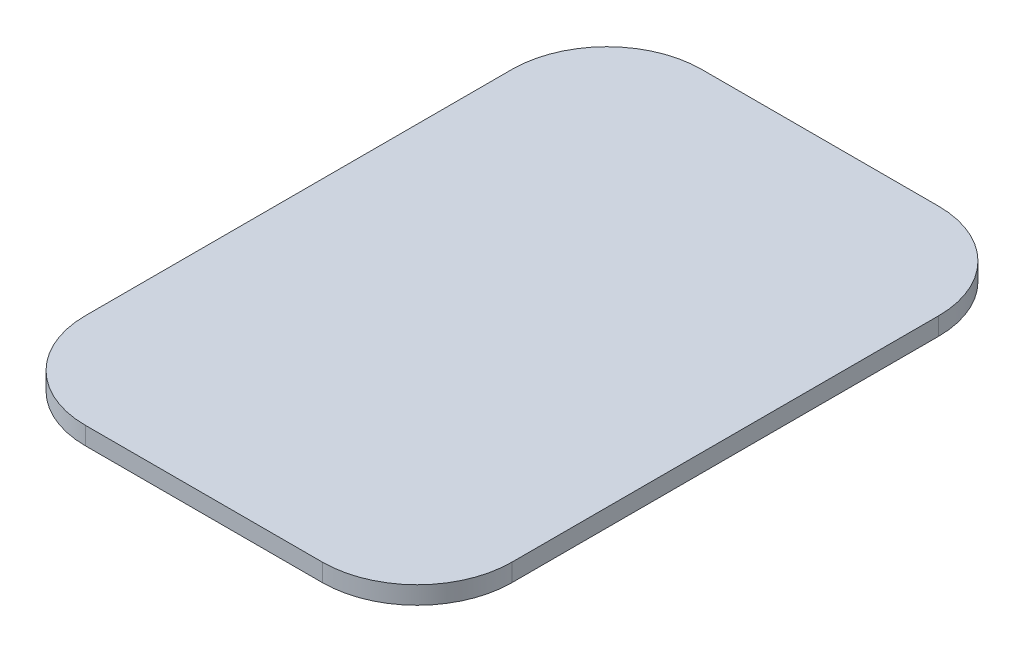
ISO-10303-21;
HEADER;
FILE_DESCRIPTION(('STEP AP214'),'2;1');
FILE_NAME('part.step','',(''),(''),'','','');
FILE_SCHEMA(('AUTOMOTIVE_DESIGN { 1 0 10303 214 1 1 1 1 }'));
ENDSEC;
DATA;
#1=APPLICATION_CONTEXT('core data for automotive mechanical design processes');
#2=APPLICATION_PROTOCOL_DEFINITION('international standard','automotive_design',2000,#1);
#3=PRODUCT_CONTEXT('',#1,'mechanical');
#4=PRODUCT('Part','Part','',(#3));
#5=PRODUCT_RELATED_PRODUCT_CATEGORY('part','',(#4));
#6=PRODUCT_DEFINITION_FORMATION('','',#4);
#7=PRODUCT_DEFINITION_CONTEXT('part definition',#1,'design');
#8=PRODUCT_DEFINITION('design','',#6,#7);
#9=PRODUCT_DEFINITION_SHAPE('','',#8);
#10=(LENGTH_UNIT() NAMED_UNIT(*) SI_UNIT(.MILLI.,.METRE.));
#11=(NAMED_UNIT(*) PLANE_ANGLE_UNIT() SI_UNIT($,.RADIAN.));
#12=(NAMED_UNIT(*) SI_UNIT($,.STERADIAN.) SOLID_ANGLE_UNIT());
#13=UNCERTAINTY_MEASURE_WITH_UNIT(LENGTH_MEASURE(1.E-05),#10,'distance_accuracy_value','');
#14=(GEOMETRIC_REPRESENTATION_CONTEXT(3) GLOBAL_UNCERTAINTY_ASSIGNED_CONTEXT((#13)) GLOBAL_UNIT_ASSIGNED_CONTEXT((#10,
#11,#12)) REPRESENTATION_CONTEXT('',''));
#15=CARTESIAN_POINT('',(0.,0.,0.));
#16=DIRECTION('',(0.,0.,1.));
#17=DIRECTION('',(1.,0.,0.));
#18=AXIS2_PLACEMENT_3D('',#15,#16,#17);
#19=CARTESIAN_POINT('',(-50.,42.5,90.0000000000001));
#20=DIRECTION('',(0.,-1.,0.));
#21=DIRECTION('',(0.,0.,-1.));
#22=AXIS2_PLACEMENT_3D('',#19,#20,#21);
#23=CYLINDRICAL_SURFACE('',#22,40.);
#24=CARTESIAN_POINT('',(-50.,35.,90.0000000000001));
#25=DIRECTION('',(0.,1.,0.));
#26=DIRECTION('',(0.,0.,1.));
#27=AXIS2_PLACEMENT_3D('',#24,#25,#26);
#28=CIRCLE('',#27,40.);
#29=CARTESIAN_POINT('',(-90.,35.,90.0000000000001));
#30=VERTEX_POINT('',#29);
#31=CARTESIAN_POINT('',(-50.,35.,130.));
#32=VERTEX_POINT('',#31);
#33=EDGE_CURVE('E128',#30,#32,#28,.T.);
#34=ORIENTED_EDGE('',*,*,#33,.T.);
#35=DIRECTION('',(0.,-1.,0.));
#36=VECTOR('',#35,1.);
#37=CARTESIAN_POINT('',(-50.,42.5,130.));
#38=LINE('',#37,#36);
#39=CARTESIAN_POINT('',(-50.,42.5,130.));
#40=VERTEX_POINT('',#39);
#41=EDGE_CURVE('E11',#40,#32,#38,.T.);
#42=ORIENTED_EDGE('',*,*,#41,.F.);
#43=CARTESIAN_POINT('',(-50.,42.5,90.0000000000001));
#44=DIRECTION('',(0.,1.,0.));
#45=DIRECTION('',(0.,0.,1.));
#46=AXIS2_PLACEMENT_3D('',#43,#44,#45);
#47=CIRCLE('',#46,40.);
#48=CARTESIAN_POINT('',(-90.,42.5,90.0000000000001));
#49=VERTEX_POINT('',#48);
#50=EDGE_CURVE('E142',#49,#40,#47,.T.);
#51=ORIENTED_EDGE('',*,*,#50,.F.);
#52=DIRECTION('',(0.,-1.,0.));
#53=VECTOR('',#52,1.);
#54=CARTESIAN_POINT('',(-90.,42.5,90.0000000000001));
#55=LINE('',#54,#53);
#56=EDGE_CURVE('E124',#49,#30,#55,.T.);
#57=ORIENTED_EDGE('',*,*,#56,.T.);
#58=EDGE_LOOP('',(#34,#42,#51,#57));
#59=FACE_BOUND('',#58,.T.);
#60=ADVANCED_FACE('F32',(#59),#23,.T.);
#61=CARTESIAN_POINT('',(-50.,42.5,130.));
#62=DIRECTION('',(0.,0.,-1.));
#63=DIRECTION('',(-1.,0.,0.));
#64=AXIS2_PLACEMENT_3D('',#61,#62,#63);
#65=PLANE('',#64);
#66=DIRECTION('',(1.,0.,0.));
#67=VECTOR('',#66,1.);
#68=CARTESIAN_POINT('',(-50.,35.,130.));
#69=LINE('',#68,#67);
#70=CARTESIAN_POINT('',(50.,35.,130.));
#71=VERTEX_POINT('',#70);
#72=EDGE_CURVE('E131',#32,#71,#69,.T.);
#73=ORIENTED_EDGE('',*,*,#72,.T.);
#74=DIRECTION('',(0.,-1.,0.));
#75=VECTOR('',#74,1.);
#76=CARTESIAN_POINT('',(50.,42.5,130.));
#77=LINE('',#76,#75);
#78=CARTESIAN_POINT('',(50.,42.5,130.));
#79=VERTEX_POINT('',#78);
#80=EDGE_CURVE('E40',#79,#71,#77,.T.);
#81=ORIENTED_EDGE('',*,*,#80,.F.);
#82=DIRECTION('',(1.,0.,0.));
#83=VECTOR('',#82,1.);
#84=CARTESIAN_POINT('',(-50.,42.5,130.));
#85=LINE('',#84,#83);
#86=EDGE_CURVE('E91',#40,#79,#85,.T.);
#87=ORIENTED_EDGE('',*,*,#86,.F.);
#88=ORIENTED_EDGE('',*,*,#41,.T.);
#89=EDGE_LOOP('',(#73,#81,#87,#88));
#90=FACE_BOUND('',#89,.T.);
#91=ADVANCED_FACE('F177',(#90),#65,.F.);
#92=CARTESIAN_POINT('',(50.,42.5,90.0000000000001));
#93=DIRECTION('',(0.,-1.,0.));
#94=DIRECTION('',(0.,0.,-1.));
#95=AXIS2_PLACEMENT_3D('',#92,#93,#94);
#96=CYLINDRICAL_SURFACE('',#95,40.);
#97=CARTESIAN_POINT('',(50.,35.,90.0000000000001));
#98=DIRECTION('',(0.,1.,0.));
#99=DIRECTION('',(0.,0.,1.));
#100=AXIS2_PLACEMENT_3D('',#97,#98,#99);
#101=CIRCLE('',#100,40.);
#102=CARTESIAN_POINT('',(90.,35.,90.0000000000001));
#103=VERTEX_POINT('',#102);
#104=EDGE_CURVE('E133',#71,#103,#101,.T.);
#105=ORIENTED_EDGE('',*,*,#104,.T.);
#106=DIRECTION('',(0.,-1.,0.));
#107=VECTOR('',#106,1.);
#108=CARTESIAN_POINT('',(90.,42.5,90.0000000000001));
#109=LINE('',#108,#107);
#110=CARTESIAN_POINT('',(90.,42.5,90.0000000000001));
#111=VERTEX_POINT('',#110);
#112=EDGE_CURVE('E149',#111,#103,#109,.T.);
#113=ORIENTED_EDGE('',*,*,#112,.F.);
#114=CARTESIAN_POINT('',(50.,42.5,90.0000000000001));
#115=DIRECTION('',(0.,1.,0.));
#116=DIRECTION('',(0.,0.,1.));
#117=AXIS2_PLACEMENT_3D('',#114,#115,#116);
#118=CIRCLE('',#117,40.);
#119=EDGE_CURVE('E157',#79,#111,#118,.T.);
#120=ORIENTED_EDGE('',*,*,#119,.F.);
#121=ORIENTED_EDGE('',*,*,#80,.T.);
#122=EDGE_LOOP('',(#105,#113,#120,#121));
#123=FACE_BOUND('',#122,.T.);
#124=ADVANCED_FACE('F155',(#123),#96,.T.);
#125=CARTESIAN_POINT('',(90.,42.5,90.0000000000001));
#126=DIRECTION('',(-1.,0.,0.));
#127=DIRECTION('',(0.,0.,1.));
#128=AXIS2_PLACEMENT_3D('',#125,#126,#127);
#129=PLANE('',#128);
#130=DIRECTION('',(0.,0.,-1.));
#131=VECTOR('',#130,1.);
#132=CARTESIAN_POINT('',(90.,35.,90.0000000000001));
#133=LINE('',#132,#131);
#134=CARTESIAN_POINT('',(90.,35.,-89.9999999999999));
#135=VERTEX_POINT('',#134);
#136=EDGE_CURVE('E135',#103,#135,#133,.T.);
#137=ORIENTED_EDGE('',*,*,#136,.T.);
#138=DIRECTION('',(0.,-1.,0.));
#139=VECTOR('',#138,1.);
#140=CARTESIAN_POINT('',(90.,42.5,-89.9999999999999));
#141=LINE('',#140,#139);
#142=CARTESIAN_POINT('',(90.,42.5,-89.9999999999999));
#143=VERTEX_POINT('',#142);
#144=EDGE_CURVE('E146',#143,#135,#141,.T.);
#145=ORIENTED_EDGE('',*,*,#144,.F.);
#146=DIRECTION('',(0.,0.,-1.));
#147=VECTOR('',#146,1.);
#148=CARTESIAN_POINT('',(90.,42.5,90.0000000000001));
#149=LINE('',#148,#147);
#150=EDGE_CURVE('E169',#111,#143,#149,.T.);
#151=ORIENTED_EDGE('',*,*,#150,.F.);
#152=ORIENTED_EDGE('',*,*,#112,.T.);
#153=EDGE_LOOP('',(#137,#145,#151,#152));
#154=FACE_BOUND('',#153,.T.);
#155=ADVANCED_FACE('F165',(#154),#129,.F.);
#156=CARTESIAN_POINT('',(50.,42.5,-89.9999999999999));
#157=DIRECTION('',(0.,-1.,0.));
#158=DIRECTION('',(0.,0.,-1.));
#159=AXIS2_PLACEMENT_3D('',#156,#157,#158);
#160=CYLINDRICAL_SURFACE('',#159,40.);
#161=CARTESIAN_POINT('',(50.,35.,-89.9999999999999));
#162=DIRECTION('',(0.,1.,0.));
#163=DIRECTION('',(0.,0.,1.));
#164=AXIS2_PLACEMENT_3D('',#161,#162,#163);
#165=CIRCLE('',#164,40.);
#166=CARTESIAN_POINT('',(50.,35.,-130.));
#167=VERTEX_POINT('',#166);
#168=EDGE_CURVE('E137',#135,#167,#165,.T.);
#169=ORIENTED_EDGE('',*,*,#168,.T.);
#170=DIRECTION('',(0.,-1.,0.));
#171=VECTOR('',#170,1.);
#172=CARTESIAN_POINT('',(50.,42.5,-130.));
#173=LINE('',#172,#171);
#174=CARTESIAN_POINT('',(50.,42.5,-130.));
#175=VERTEX_POINT('',#174);
#176=EDGE_CURVE('E119',#175,#167,#173,.T.);
#177=ORIENTED_EDGE('',*,*,#176,.F.);
#178=CARTESIAN_POINT('',(50.,42.5,-89.9999999999999));
#179=DIRECTION('',(0.,1.,0.));
#180=DIRECTION('',(0.,0.,1.));
#181=AXIS2_PLACEMENT_3D('',#178,#179,#180);
#182=CIRCLE('',#181,40.);
#183=EDGE_CURVE('E110',#143,#175,#182,.T.);
#184=ORIENTED_EDGE('',*,*,#183,.F.);
#185=ORIENTED_EDGE('',*,*,#144,.T.);
#186=EDGE_LOOP('',(#169,#177,#184,#185));
#187=FACE_BOUND('',#186,.T.);
#188=ADVANCED_FACE('F168',(#187),#160,.T.);
#189=CARTESIAN_POINT('',(50.,42.5,-130.));
#190=DIRECTION('',(0.,0.,1.));
#191=DIRECTION('',(1.,0.,0.));
#192=AXIS2_PLACEMENT_3D('',#189,#190,#191);
#193=PLANE('',#192);
#194=DIRECTION('',(-1.,0.,0.));
#195=VECTOR('',#194,1.);
#196=CARTESIAN_POINT('',(50.,35.,-130.));
#197=LINE('',#196,#195);
#198=CARTESIAN_POINT('',(-50.,35.,-130.));
#199=VERTEX_POINT('',#198);
#200=EDGE_CURVE('E118',#167,#199,#197,.T.);
#201=ORIENTED_EDGE('',*,*,#200,.T.);
#202=DIRECTION('',(0.,-1.,0.));
#203=VECTOR('',#202,1.);
#204=CARTESIAN_POINT('',(-50.,42.5,-130.));
#205=LINE('',#204,#203);
#206=CARTESIAN_POINT('',(-50.,42.5,-130.));
#207=VERTEX_POINT('',#206);
#208=EDGE_CURVE('E115',#207,#199,#205,.T.);
#209=ORIENTED_EDGE('',*,*,#208,.F.);
#210=DIRECTION('',(-1.,0.,0.));
#211=VECTOR('',#210,1.);
#212=CARTESIAN_POINT('',(50.,42.5,-130.));
#213=LINE('',#212,#211);
#214=EDGE_CURVE('E104',#175,#207,#213,.T.);
#215=ORIENTED_EDGE('',*,*,#214,.F.);
#216=ORIENTED_EDGE('',*,*,#176,.T.);
#217=EDGE_LOOP('',(#201,#209,#215,#216));
#218=FACE_BOUND('',#217,.T.);
#219=ADVANCED_FACE('F116',(#218),#193,.F.);
#220=CARTESIAN_POINT('',(-50.,42.5,-89.9999999999999));
#221=DIRECTION('',(0.,-1.,0.));
#222=DIRECTION('',(0.,0.,-1.));
#223=AXIS2_PLACEMENT_3D('',#220,#221,#222);
#224=CYLINDRICAL_SURFACE('',#223,40.);
#225=CARTESIAN_POINT('',(-50.,35.,-89.9999999999999));
#226=DIRECTION('',(0.,1.,0.));
#227=DIRECTION('',(0.,0.,1.));
#228=AXIS2_PLACEMENT_3D('',#225,#226,#227);
#229=CIRCLE('',#228,40.);
#230=CARTESIAN_POINT('',(-90.,35.,-90.));
#231=VERTEX_POINT('',#230);
#232=EDGE_CURVE('E77',#199,#231,#229,.T.);
#233=ORIENTED_EDGE('',*,*,#232,.T.);
#234=DIRECTION('',(0.,-1.,0.));
#235=VECTOR('',#234,1.);
#236=CARTESIAN_POINT('',(-90.,42.5,-90.));
#237=LINE('',#236,#235);
#238=CARTESIAN_POINT('',(-90.,42.5,-90.));
#239=VERTEX_POINT('',#238);
#240=EDGE_CURVE('E120',#239,#231,#237,.T.);
#241=ORIENTED_EDGE('',*,*,#240,.F.);
#242=CARTESIAN_POINT('',(-50.,42.5,-89.9999999999999));
#243=DIRECTION('',(0.,1.,0.));
#244=DIRECTION('',(0.,0.,1.));
#245=AXIS2_PLACEMENT_3D('',#242,#243,#244);
#246=CIRCLE('',#245,40.);
#247=EDGE_CURVE('E108',#207,#239,#246,.T.);
#248=ORIENTED_EDGE('',*,*,#247,.F.);
#249=ORIENTED_EDGE('',*,*,#208,.T.);
#250=EDGE_LOOP('',(#233,#241,#248,#249));
#251=FACE_BOUND('',#250,.T.);
#252=ADVANCED_FACE('F122',(#251),#224,.T.);
#253=CARTESIAN_POINT('',(-90.,42.5,-89.9999999999999));
#254=DIRECTION('',(1.,0.,0.));
#255=DIRECTION('',(0.,0.,-1.));
#256=AXIS2_PLACEMENT_3D('',#253,#254,#255);
#257=PLANE('',#256);
#258=DIRECTION('',(0.,0.,1.));
#259=VECTOR('',#258,1.);
#260=CARTESIAN_POINT('',(-90.,35.,-89.9999999999999));
#261=LINE('',#260,#259);
#262=EDGE_CURVE('E83',#231,#30,#261,.T.);
#263=ORIENTED_EDGE('',*,*,#262,.T.);
#264=ORIENTED_EDGE('',*,*,#56,.F.);
#265=DIRECTION('',(0.,0.,1.));
#266=VECTOR('',#265,1.);
#267=CARTESIAN_POINT('',(-90.,42.5,-89.9999999999999));
#268=LINE('',#267,#266);
#269=EDGE_CURVE('E48',#239,#49,#268,.T.);
#270=ORIENTED_EDGE('',*,*,#269,.F.);
#271=ORIENTED_EDGE('',*,*,#240,.T.);
#272=EDGE_LOOP('',(#263,#264,#270,#271));
#273=FACE_BOUND('',#272,.T.);
#274=ADVANCED_FACE('F193',(#273),#257,.F.);
#275=CARTESIAN_POINT('',(-50.,42.5,90.0000000000001));
#276=DIRECTION('',(0.,1.,0.));
#277=DIRECTION('',(0.,0.,1.));
#278=AXIS2_PLACEMENT_3D('',#275,#276,#277);
#279=PLANE('',#278);
#280=ORIENTED_EDGE('',*,*,#50,.T.);
#281=ORIENTED_EDGE('',*,*,#86,.T.);
#282=ORIENTED_EDGE('',*,*,#119,.T.);
#283=ORIENTED_EDGE('',*,*,#150,.T.);
#284=ORIENTED_EDGE('',*,*,#183,.T.);
#285=ORIENTED_EDGE('',*,*,#214,.T.);
#286=ORIENTED_EDGE('',*,*,#247,.T.);
#287=ORIENTED_EDGE('',*,*,#269,.T.);
#288=EDGE_LOOP('',(#280,#281,#282,#283,#284,#285,#286,#287));
#289=FACE_BOUND('',#288,.T.);
#290=ADVANCED_FACE('F106',(#289),#279,.T.);
#291=CARTESIAN_POINT('',(-50.,35.,90.0000000000001));
#292=DIRECTION('',(0.,1.,0.));
#293=DIRECTION('',(0.,0.,1.));
#294=AXIS2_PLACEMENT_3D('',#291,#292,#293);
#295=PLANE('',#294);
#296=ORIENTED_EDGE('',*,*,#33,.F.);
#297=ORIENTED_EDGE('',*,*,#262,.F.);
#298=ORIENTED_EDGE('',*,*,#232,.F.);
#299=ORIENTED_EDGE('',*,*,#200,.F.);
#300=ORIENTED_EDGE('',*,*,#168,.F.);
#301=ORIENTED_EDGE('',*,*,#136,.F.);
#302=ORIENTED_EDGE('',*,*,#104,.F.);
#303=ORIENTED_EDGE('',*,*,#72,.F.);
#304=EDGE_LOOP('',(#296,#297,#298,#299,#300,#301,#302,#303));
#305=FACE_BOUND('',#304,.T.);
#306=ADVANCED_FACE('F161',(#305),#295,.F.);
#307=CLOSED_SHELL('',(#60,#91,#124,#155,#188,#219,#252,#274,#290,#306));
#308=MANIFOLD_SOLID_BREP('B2',#307);
#309=ADVANCED_BREP_SHAPE_REPRESENTATION('',(#18,#308),#14);
#310=SHAPE_DEFINITION_REPRESENTATION(#9,#309);
ENDSEC;
END-ISO-10303-21;
